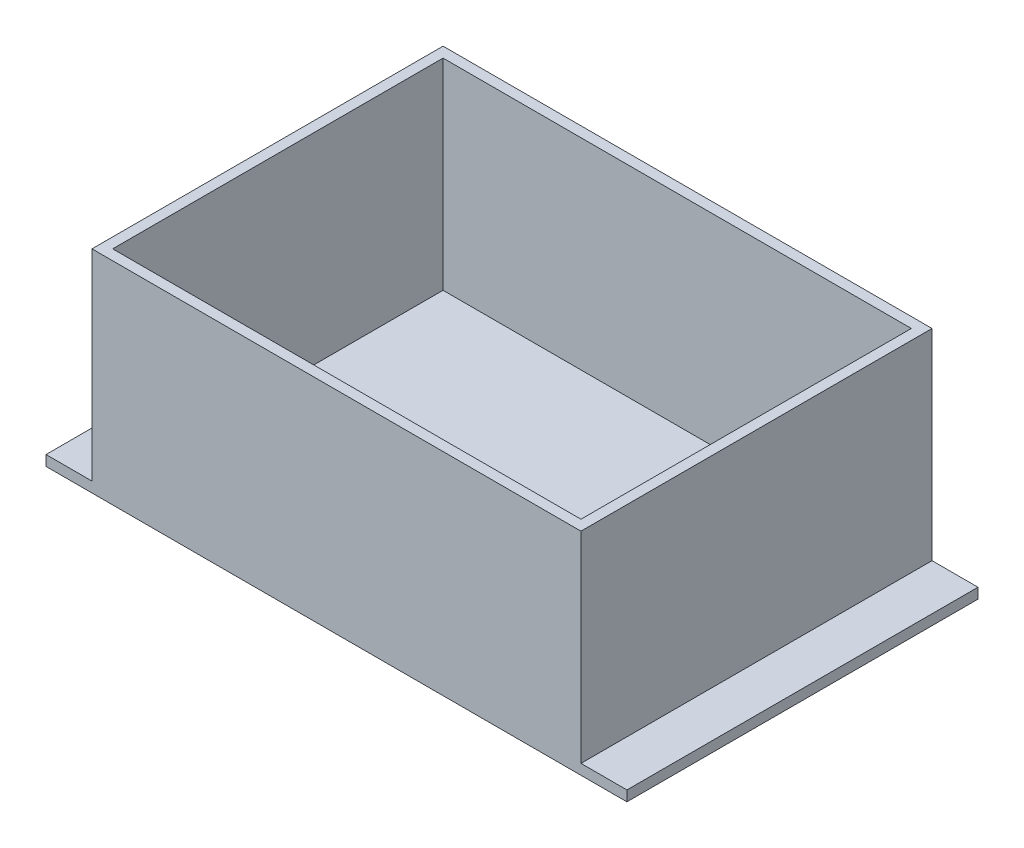
ISO-10303-21;
HEADER;
FILE_DESCRIPTION(('STEP AP214'),'2;1');
FILE_NAME('part.step','',(''),(''),'','','');
FILE_SCHEMA(('AUTOMOTIVE_DESIGN { 1 0 10303 214 1 1 1 1 }'));
ENDSEC;
DATA;
#1=APPLICATION_CONTEXT('core data for automotive mechanical design processes');
#2=APPLICATION_PROTOCOL_DEFINITION('international standard','automotive_design',2000,#1);
#3=PRODUCT_CONTEXT('',#1,'mechanical');
#4=PRODUCT('Part','Part','',(#3));
#5=PRODUCT_RELATED_PRODUCT_CATEGORY('part','',(#4));
#6=PRODUCT_DEFINITION_FORMATION('','',#4);
#7=PRODUCT_DEFINITION_CONTEXT('part definition',#1,'design');
#8=PRODUCT_DEFINITION('design','',#6,#7);
#9=PRODUCT_DEFINITION_SHAPE('','',#8);
#10=(LENGTH_UNIT() NAMED_UNIT(*) SI_UNIT(.MILLI.,.METRE.));
#11=(NAMED_UNIT(*) PLANE_ANGLE_UNIT() SI_UNIT($,.RADIAN.));
#12=(NAMED_UNIT(*) SI_UNIT($,.STERADIAN.) SOLID_ANGLE_UNIT());
#13=UNCERTAINTY_MEASURE_WITH_UNIT(LENGTH_MEASURE(1.E-05),#10,'distance_accuracy_value','');
#14=(GEOMETRIC_REPRESENTATION_CONTEXT(3) GLOBAL_UNCERTAINTY_ASSIGNED_CONTEXT((#13)) GLOBAL_UNIT_ASSIGNED_CONTEXT((#10,
#11,#12)) REPRESENTATION_CONTEXT('',''));
#15=CARTESIAN_POINT('',(0.,0.,0.));
#16=DIRECTION('',(0.,0.,1.));
#17=DIRECTION('',(1.,0.,0.));
#18=AXIS2_PLACEMENT_3D('',#15,#16,#17);
#19=CARTESIAN_POINT('',(0.,35.,0.));
#20=DIRECTION('',(0.,-1.,0.));
#21=DIRECTION('',(0.,0.,-1.));
#22=AXIS2_PLACEMENT_3D('',#19,#20,#21);
#23=PLANE('',#22);
#24=DIRECTION('',(0.,0.,1.));
#25=VECTOR('',#24,1.);
#26=CARTESIAN_POINT('',(-1.8,35.,1.8));
#27=LINE('',#26,#25);
#28=CARTESIAN_POINT('',(-1.8,35.,-59.3));
#29=VERTEX_POINT('',#28);
#30=CARTESIAN_POINT('',(-1.8,35.,1.8));
#31=VERTEX_POINT('',#30);
#32=EDGE_CURVE('E188',#29,#31,#27,.T.);
#33=ORIENTED_EDGE('',*,*,#32,.T.);
#34=DIRECTION('',(1.,0.,0.));
#35=VECTOR('',#34,1.);
#36=CARTESIAN_POINT('',(-1.8,35.,1.8));
#37=LINE('',#36,#35);
#38=CARTESIAN_POINT('',(83.3,35.,1.8));
#39=VERTEX_POINT('',#38);
#40=EDGE_CURVE('E191',#31,#39,#37,.T.);
#41=ORIENTED_EDGE('',*,*,#40,.T.);
#42=DIRECTION('',(0.,0.,-1.));
#43=VECTOR('',#42,1.);
#44=CARTESIAN_POINT('',(83.3,35.,1.8));
#45=LINE('',#44,#43);
#46=CARTESIAN_POINT('',(83.3,35.,-59.3));
#47=VERTEX_POINT('',#46);
#48=EDGE_CURVE('E194',#39,#47,#45,.T.);
#49=ORIENTED_EDGE('',*,*,#48,.T.);
#50=DIRECTION('',(-1.,0.,0.));
#51=VECTOR('',#50,1.);
#52=CARTESIAN_POINT('',(-1.8,35.,-59.3));
#53=LINE('',#52,#51);
#54=EDGE_CURVE('E196',#47,#29,#53,.T.);
#55=ORIENTED_EDGE('',*,*,#54,.T.);
#56=EDGE_LOOP('',(#33,#41,#49,#55));
#57=FACE_BOUND('',#56,.T.);
#58=DIRECTION('',(0.,0.,1.));
#59=VECTOR('',#58,1.);
#60=CARTESIAN_POINT('',(0.,35.,0.));
#61=LINE('',#60,#59);
#62=CARTESIAN_POINT('',(0.,35.,-57.5));
#63=VERTEX_POINT('',#62);
#64=CARTESIAN_POINT('',(0.,35.,0.));
#65=VERTEX_POINT('',#64);
#66=EDGE_CURVE('E164',#63,#65,#61,.T.);
#67=ORIENTED_EDGE('',*,*,#66,.F.);
#68=DIRECTION('',(-1.,0.,0.));
#69=VECTOR('',#68,1.);
#70=CARTESIAN_POINT('',(0.,35.,-57.5));
#71=LINE('',#70,#69);
#72=CARTESIAN_POINT('',(81.5,35.,-57.5));
#73=VERTEX_POINT('',#72);
#74=EDGE_CURVE('E171',#73,#63,#71,.T.);
#75=ORIENTED_EDGE('',*,*,#74,.F.);
#76=DIRECTION('',(0.,0.,-1.));
#77=VECTOR('',#76,1.);
#78=CARTESIAN_POINT('',(81.5,35.,0.));
#79=LINE('',#78,#77);
#80=CARTESIAN_POINT('',(81.5,35.,0.));
#81=VERTEX_POINT('',#80);
#82=EDGE_CURVE('E169',#81,#73,#79,.T.);
#83=ORIENTED_EDGE('',*,*,#82,.F.);
#84=DIRECTION('',(1.,0.,0.));
#85=VECTOR('',#84,1.);
#86=CARTESIAN_POINT('',(0.,35.,0.));
#87=LINE('',#86,#85);
#88=EDGE_CURVE('E166',#65,#81,#87,.T.);
#89=ORIENTED_EDGE('',*,*,#88,.F.);
#90=EDGE_LOOP('',(#67,#75,#83,#89));
#91=FACE_BOUND('',#90,.T.);
#92=ADVANCED_FACE('F39',(#57,#91),#23,.F.);
#93=CARTESIAN_POINT('',(-1.8,35.,1.8));
#94=DIRECTION('',(1.,0.,0.));
#95=DIRECTION('',(0.,0.,-1.));
#96=AXIS2_PLACEMENT_3D('',#93,#94,#95);
#97=PLANE('',#96);
#98=DIRECTION('',(0.,0.,1.));
#99=VECTOR('',#98,1.);
#100=CARTESIAN_POINT('',(-1.8,0.,1.8));
#101=LINE('',#100,#99);
#102=CARTESIAN_POINT('',(-1.8,0.,-59.3));
#103=VERTEX_POINT('',#102);
#104=CARTESIAN_POINT('',(-1.8,0.,1.8));
#105=VERTEX_POINT('',#104);
#106=EDGE_CURVE('E187',#103,#105,#101,.T.);
#107=ORIENTED_EDGE('',*,*,#106,.T.);
#108=DIRECTION('',(0.,-1.,0.));
#109=VECTOR('',#108,1.);
#110=CARTESIAN_POINT('',(-1.8,35.,1.8));
#111=LINE('',#110,#109);
#112=EDGE_CURVE('E11',#31,#105,#111,.T.);
#113=ORIENTED_EDGE('',*,*,#112,.F.);
#114=ORIENTED_EDGE('',*,*,#32,.F.);
#115=DIRECTION('',(0.,-1.,0.));
#116=VECTOR('',#115,1.);
#117=CARTESIAN_POINT('',(-1.8,35.,-59.3));
#118=LINE('',#117,#116);
#119=EDGE_CURVE('E198',#29,#103,#118,.T.);
#120=ORIENTED_EDGE('',*,*,#119,.T.);
#121=EDGE_LOOP('',(#107,#113,#114,#120));
#122=FACE_BOUND('',#121,.T.);
#123=ADVANCED_FACE('F41',(#122),#97,.F.);
#124=CARTESIAN_POINT('',(-1.8,35.,1.8));
#125=DIRECTION('',(0.,0.,-1.));
#126=DIRECTION('',(-1.,0.,0.));
#127=AXIS2_PLACEMENT_3D('',#124,#125,#126);
#128=PLANE('',#127);
#129=ORIENTED_EDGE('',*,*,#112,.T.);
#130=DIRECTION('',(-1.,0.,0.));
#131=VECTOR('',#130,1.);
#132=CARTESIAN_POINT('',(-9.8,0.,1.8));
#133=LINE('',#132,#131);
#134=CARTESIAN_POINT('',(-9.8,0.,1.8));
#135=VERTEX_POINT('',#134);
#136=EDGE_CURVE('E220',#105,#135,#133,.T.);
#137=ORIENTED_EDGE('',*,*,#136,.T.);
#138=DIRECTION('',(0.,1.,0.));
#139=VECTOR('',#138,1.);
#140=CARTESIAN_POINT('',(-9.8,-1.8,1.8));
#141=LINE('',#140,#139);
#142=CARTESIAN_POINT('',(-9.8,-1.8,1.8));
#143=VERTEX_POINT('',#142);
#144=EDGE_CURVE('E226',#143,#135,#141,.T.);
#145=ORIENTED_EDGE('',*,*,#144,.F.);
#146=DIRECTION('',(-1.,0.,0.));
#147=VECTOR('',#146,1.);
#148=CARTESIAN_POINT('',(-9.8,-1.8,1.8));
#149=LINE('',#148,#147);
#150=CARTESIAN_POINT('',(91.3,-1.8,1.8));
#151=VERTEX_POINT('',#150);
#152=EDGE_CURVE('E148',#151,#143,#149,.T.);
#153=ORIENTED_EDGE('',*,*,#152,.F.);
#154=DIRECTION('',(0.,1.,0.));
#155=VECTOR('',#154,1.);
#156=CARTESIAN_POINT('',(91.3,-1.8,1.8));
#157=LINE('',#156,#155);
#158=CARTESIAN_POINT('',(91.3,0.,1.8));
#159=VERTEX_POINT('',#158);
#160=EDGE_CURVE('E160',#151,#159,#157,.T.);
#161=ORIENTED_EDGE('',*,*,#160,.T.);
#162=CARTESIAN_POINT('',(83.3,0.,1.8));
#163=VERTEX_POINT('',#162);
#164=EDGE_CURVE('E152',#159,#163,#133,.T.);
#165=ORIENTED_EDGE('',*,*,#164,.T.);
#166=DIRECTION('',(0.,-1.,0.));
#167=VECTOR('',#166,1.);
#168=CARTESIAN_POINT('',(83.3,35.,1.8));
#169=LINE('',#168,#167);
#170=EDGE_CURVE('E47',#39,#163,#169,.T.);
#171=ORIENTED_EDGE('',*,*,#170,.F.);
#172=ORIENTED_EDGE('',*,*,#40,.F.);
#173=EDGE_LOOP('',(#129,#137,#145,#153,#161,#165,#171,#172));
#174=FACE_BOUND('',#173,.T.);
#175=ADVANCED_FACE('F214',(#174),#128,.F.);
#176=CARTESIAN_POINT('',(83.3,35.,1.8));
#177=DIRECTION('',(-1.,0.,0.));
#178=DIRECTION('',(0.,0.,1.));
#179=AXIS2_PLACEMENT_3D('',#176,#177,#178);
#180=PLANE('',#179);
#181=DIRECTION('',(0.,0.,-1.));
#182=VECTOR('',#181,1.);
#183=CARTESIAN_POINT('',(83.3,0.,1.8));
#184=LINE('',#183,#182);
#185=CARTESIAN_POINT('',(83.3,0.,-59.3));
#186=VERTEX_POINT('',#185);
#187=EDGE_CURVE('E192',#163,#186,#184,.T.);
#188=ORIENTED_EDGE('',*,*,#187,.T.);
#189=DIRECTION('',(0.,-1.,0.));
#190=VECTOR('',#189,1.);
#191=CARTESIAN_POINT('',(83.3,35.,-59.3));
#192=LINE('',#191,#190);
#193=EDGE_CURVE('E205',#47,#186,#192,.T.);
#194=ORIENTED_EDGE('',*,*,#193,.F.);
#195=ORIENTED_EDGE('',*,*,#48,.F.);
#196=ORIENTED_EDGE('',*,*,#170,.T.);
#197=EDGE_LOOP('',(#188,#194,#195,#196));
#198=FACE_BOUND('',#197,.T.);
#199=ADVANCED_FACE('F210',(#198),#180,.F.);
#200=CARTESIAN_POINT('',(-1.8,35.,-59.3));
#201=DIRECTION('',(0.,0.,1.));
#202=DIRECTION('',(1.,0.,0.));
#203=AXIS2_PLACEMENT_3D('',#200,#201,#202);
#204=PLANE('',#203);
#205=ORIENTED_EDGE('',*,*,#193,.T.);
#206=DIRECTION('',(1.,0.,0.));
#207=VECTOR('',#206,1.);
#208=CARTESIAN_POINT('',(-9.79999999999999,0.,-59.3));
#209=LINE('',#208,#207);
#210=CARTESIAN_POINT('',(91.3,0.,-59.3));
#211=VERTEX_POINT('',#210);
#212=EDGE_CURVE('E230',#186,#211,#209,.T.);
#213=ORIENTED_EDGE('',*,*,#212,.T.);
#214=DIRECTION('',(0.,1.,0.));
#215=VECTOR('',#214,1.);
#216=CARTESIAN_POINT('',(91.3,-1.8,-59.3));
#217=LINE('',#216,#215);
#218=CARTESIAN_POINT('',(91.3,-1.8,-59.3));
#219=VERTEX_POINT('',#218);
#220=EDGE_CURVE('E139',#219,#211,#217,.T.);
#221=ORIENTED_EDGE('',*,*,#220,.F.);
#222=DIRECTION('',(1.,0.,0.));
#223=VECTOR('',#222,1.);
#224=CARTESIAN_POINT('',(-9.79999999999999,-1.8,-59.3));
#225=LINE('',#224,#223);
#226=CARTESIAN_POINT('',(-9.79999999999999,-1.8,-59.3));
#227=VERTEX_POINT('',#226);
#228=EDGE_CURVE('E130',#227,#219,#225,.T.);
#229=ORIENTED_EDGE('',*,*,#228,.F.);
#230=DIRECTION('',(0.,1.,0.));
#231=VECTOR('',#230,1.);
#232=CARTESIAN_POINT('',(-9.79999999999999,-1.8,-59.3));
#233=LINE('',#232,#231);
#234=CARTESIAN_POINT('',(-9.79999999999999,0.,-59.3));
#235=VERTEX_POINT('',#234);
#236=EDGE_CURVE('E136',#227,#235,#233,.T.);
#237=ORIENTED_EDGE('',*,*,#236,.T.);
#238=EDGE_CURVE('E231',#235,#103,#209,.T.);
#239=ORIENTED_EDGE('',*,*,#238,.T.);
#240=ORIENTED_EDGE('',*,*,#119,.F.);
#241=ORIENTED_EDGE('',*,*,#54,.F.);
#242=EDGE_LOOP('',(#205,#213,#221,#229,#237,#239,#240,#241));
#243=FACE_BOUND('',#242,.T.);
#244=ADVANCED_FACE('F133',(#243),#204,.F.);
#245=CARTESIAN_POINT('',(0.,35.,0.));
#246=DIRECTION('',(1.,0.,0.));
#247=DIRECTION('',(0.,0.,-1.));
#248=AXIS2_PLACEMENT_3D('',#245,#246,#247);
#249=PLANE('',#248);
#250=DIRECTION('',(0.,0.,1.));
#251=VECTOR('',#250,1.);
#252=CARTESIAN_POINT('',(0.,0.,0.));
#253=LINE('',#252,#251);
#254=CARTESIAN_POINT('',(0.,0.,-57.5));
#255=VERTEX_POINT('',#254);
#256=CARTESIAN_POINT('',(0.,0.,0.));
#257=VERTEX_POINT('',#256);
#258=EDGE_CURVE('E62',#255,#257,#253,.T.);
#259=ORIENTED_EDGE('',*,*,#258,.F.);
#260=DIRECTION('',(0.,-1.,0.));
#261=VECTOR('',#260,1.);
#262=CARTESIAN_POINT('',(0.,35.,-57.5));
#263=LINE('',#262,#261);
#264=EDGE_CURVE('E172',#63,#255,#263,.T.);
#265=ORIENTED_EDGE('',*,*,#264,.F.);
#266=ORIENTED_EDGE('',*,*,#66,.T.);
#267=DIRECTION('',(0.,-1.,0.));
#268=VECTOR('',#267,1.);
#269=CARTESIAN_POINT('',(0.,35.,0.));
#270=LINE('',#269,#268);
#271=EDGE_CURVE('E185',#65,#257,#270,.T.);
#272=ORIENTED_EDGE('',*,*,#271,.T.);
#273=EDGE_LOOP('',(#259,#265,#266,#272));
#274=FACE_BOUND('',#273,.T.);
#275=ADVANCED_FACE('F261',(#274),#249,.T.);
#276=CARTESIAN_POINT('',(0.,35.,0.));
#277=DIRECTION('',(0.,0.,-1.));
#278=DIRECTION('',(-1.,0.,0.));
#279=AXIS2_PLACEMENT_3D('',#276,#277,#278);
#280=PLANE('',#279);
#281=DIRECTION('',(1.,0.,0.));
#282=VECTOR('',#281,1.);
#283=CARTESIAN_POINT('',(0.,0.,0.));
#284=LINE('',#283,#282);
#285=CARTESIAN_POINT('',(81.5,0.,0.));
#286=VERTEX_POINT('',#285);
#287=EDGE_CURVE('E158',#257,#286,#284,.T.);
#288=ORIENTED_EDGE('',*,*,#287,.F.);
#289=ORIENTED_EDGE('',*,*,#271,.F.);
#290=ORIENTED_EDGE('',*,*,#88,.T.);
#291=DIRECTION('',(0.,-1.,0.));
#292=VECTOR('',#291,1.);
#293=CARTESIAN_POINT('',(81.5,35.,0.));
#294=LINE('',#293,#292);
#295=EDGE_CURVE('E183',#81,#286,#294,.T.);
#296=ORIENTED_EDGE('',*,*,#295,.T.);
#297=EDGE_LOOP('',(#288,#289,#290,#296));
#298=FACE_BOUND('',#297,.T.);
#299=ADVANCED_FACE('F290',(#298),#280,.T.);
#300=CARTESIAN_POINT('',(81.5,35.,0.));
#301=DIRECTION('',(-1.,0.,0.));
#302=DIRECTION('',(0.,0.,1.));
#303=AXIS2_PLACEMENT_3D('',#300,#301,#302);
#304=PLANE('',#303);
#305=DIRECTION('',(0.,0.,-1.));
#306=VECTOR('',#305,1.);
#307=CARTESIAN_POINT('',(81.5,0.,0.));
#308=LINE('',#307,#306);
#309=CARTESIAN_POINT('',(81.5,0.,-57.5));
#310=VERTEX_POINT('',#309);
#311=EDGE_CURVE('E176',#286,#310,#308,.T.);
#312=ORIENTED_EDGE('',*,*,#311,.F.);
#313=ORIENTED_EDGE('',*,*,#295,.F.);
#314=ORIENTED_EDGE('',*,*,#82,.T.);
#315=DIRECTION('',(0.,-1.,0.));
#316=VECTOR('',#315,1.);
#317=CARTESIAN_POINT('',(81.5,35.,-57.5));
#318=LINE('',#317,#316);
#319=EDGE_CURVE('E54',#73,#310,#318,.T.);
#320=ORIENTED_EDGE('',*,*,#319,.T.);
#321=EDGE_LOOP('',(#312,#313,#314,#320));
#322=FACE_BOUND('',#321,.T.);
#323=ADVANCED_FACE('F297',(#322),#304,.T.);
#324=CARTESIAN_POINT('',(0.,35.,-57.5));
#325=DIRECTION('',(0.,0.,1.));
#326=DIRECTION('',(1.,0.,0.));
#327=AXIS2_PLACEMENT_3D('',#324,#325,#326);
#328=PLANE('',#327);
#329=DIRECTION('',(-1.,0.,0.));
#330=VECTOR('',#329,1.);
#331=CARTESIAN_POINT('',(0.,0.,-57.5));
#332=LINE('',#331,#330);
#333=EDGE_CURVE('E167',#310,#255,#332,.T.);
#334=ORIENTED_EDGE('',*,*,#333,.F.);
#335=ORIENTED_EDGE('',*,*,#319,.F.);
#336=ORIENTED_EDGE('',*,*,#74,.T.);
#337=ORIENTED_EDGE('',*,*,#264,.T.);
#338=EDGE_LOOP('',(#334,#335,#336,#337));
#339=FACE_BOUND('',#338,.T.);
#340=ADVANCED_FACE('F249',(#339),#328,.T.);
#341=CARTESIAN_POINT('',(0.,0.,0.));
#342=DIRECTION('',(0.,-1.,0.));
#343=DIRECTION('',(0.,0.,-1.));
#344=AXIS2_PLACEMENT_3D('',#341,#342,#343);
#345=PLANE('',#344);
#346=ORIENTED_EDGE('',*,*,#311,.T.);
#347=ORIENTED_EDGE('',*,*,#333,.T.);
#348=ORIENTED_EDGE('',*,*,#258,.T.);
#349=ORIENTED_EDGE('',*,*,#287,.T.);
#350=EDGE_LOOP('',(#346,#347,#348,#349));
#351=FACE_BOUND('',#350,.T.);
#352=ADVANCED_FACE('F240',(#351),#345,.F.);
#353=ORIENTED_EDGE('',*,*,#106,.F.);
#354=ORIENTED_EDGE('',*,*,#238,.F.);
#355=DIRECTION('',(0.,0.,-1.));
#356=VECTOR('',#355,1.);
#357=CARTESIAN_POINT('',(-9.8,0.,1.8));
#358=LINE('',#357,#356);
#359=EDGE_CURVE('E156',#135,#235,#358,.T.);
#360=ORIENTED_EDGE('',*,*,#359,.F.);
#361=ORIENTED_EDGE('',*,*,#136,.F.);
#362=EDGE_LOOP('',(#353,#354,#360,#361));
#363=FACE_BOUND('',#362,.T.);
#364=ADVANCED_FACE('F239',(#363),#345,.F.);
#365=CARTESIAN_POINT('',(-9.8,-1.8,1.8));
#366=DIRECTION('',(1.,0.,0.));
#367=DIRECTION('',(0.,0.,-1.));
#368=AXIS2_PLACEMENT_3D('',#365,#366,#367);
#369=PLANE('',#368);
#370=ORIENTED_EDGE('',*,*,#359,.T.);
#371=ORIENTED_EDGE('',*,*,#236,.F.);
#372=DIRECTION('',(0.,0.,-1.));
#373=VECTOR('',#372,1.);
#374=CARTESIAN_POINT('',(-9.8,-1.8,1.8));
#375=LINE('',#374,#373);
#376=EDGE_CURVE('E143',#143,#227,#375,.T.);
#377=ORIENTED_EDGE('',*,*,#376,.F.);
#378=ORIENTED_EDGE('',*,*,#144,.T.);
#379=EDGE_LOOP('',(#370,#371,#377,#378));
#380=FACE_BOUND('',#379,.T.);
#381=ADVANCED_FACE('F154',(#380),#369,.F.);
#382=CARTESIAN_POINT('',(91.3,-1.8,1.8));
#383=DIRECTION('',(-1.,0.,0.));
#384=DIRECTION('',(0.,0.,1.));
#385=AXIS2_PLACEMENT_3D('',#382,#383,#384);
#386=PLANE('',#385);
#387=DIRECTION('',(0.,0.,1.));
#388=VECTOR('',#387,1.);
#389=CARTESIAN_POINT('',(91.3,0.,1.8));
#390=LINE('',#389,#388);
#391=EDGE_CURVE('E222',#211,#159,#390,.T.);
#392=ORIENTED_EDGE('',*,*,#391,.T.);
#393=ORIENTED_EDGE('',*,*,#160,.F.);
#394=DIRECTION('',(0.,0.,1.));
#395=VECTOR('',#394,1.);
#396=CARTESIAN_POINT('',(91.3,-1.8,1.8));
#397=LINE('',#396,#395);
#398=EDGE_CURVE('E142',#219,#151,#397,.T.);
#399=ORIENTED_EDGE('',*,*,#398,.F.);
#400=ORIENTED_EDGE('',*,*,#220,.T.);
#401=EDGE_LOOP('',(#392,#393,#399,#400));
#402=FACE_BOUND('',#401,.T.);
#403=ADVANCED_FACE('F235',(#402),#386,.F.);
#404=CARTESIAN_POINT('',(0.,-1.8,0.));
#405=DIRECTION('',(0.,-1.,0.));
#406=DIRECTION('',(0.,0.,-1.));
#407=AXIS2_PLACEMENT_3D('',#404,#405,#406);
#408=PLANE('',#407);
#409=ORIENTED_EDGE('',*,*,#376,.T.);
#410=ORIENTED_EDGE('',*,*,#228,.T.);
#411=ORIENTED_EDGE('',*,*,#398,.T.);
#412=ORIENTED_EDGE('',*,*,#152,.T.);
#413=EDGE_LOOP('',(#409,#410,#411,#412));
#414=FACE_BOUND('',#413,.T.);
#415=ADVANCED_FACE('F146',(#414),#408,.T.);
#416=ORIENTED_EDGE('',*,*,#187,.F.);
#417=ORIENTED_EDGE('',*,*,#164,.F.);
#418=ORIENTED_EDGE('',*,*,#391,.F.);
#419=ORIENTED_EDGE('',*,*,#212,.F.);
#420=EDGE_LOOP('',(#416,#417,#418,#419));
#421=FACE_BOUND('',#420,.T.);
#422=ADVANCED_FACE('F236',(#421),#345,.F.);
#423=CLOSED_SHELL('',(#92,#123,#175,#199,#244,#275,#299,#323,#340,#352,#364,#381,#403,#415,#422));
#424=MANIFOLD_SOLID_BREP('B2',#423);
#425=ADVANCED_BREP_SHAPE_REPRESENTATION('',(#18,#424),#14);
#426=SHAPE_DEFINITION_REPRESENTATION(#9,#425);
ENDSEC;
END-ISO-10303-21;
